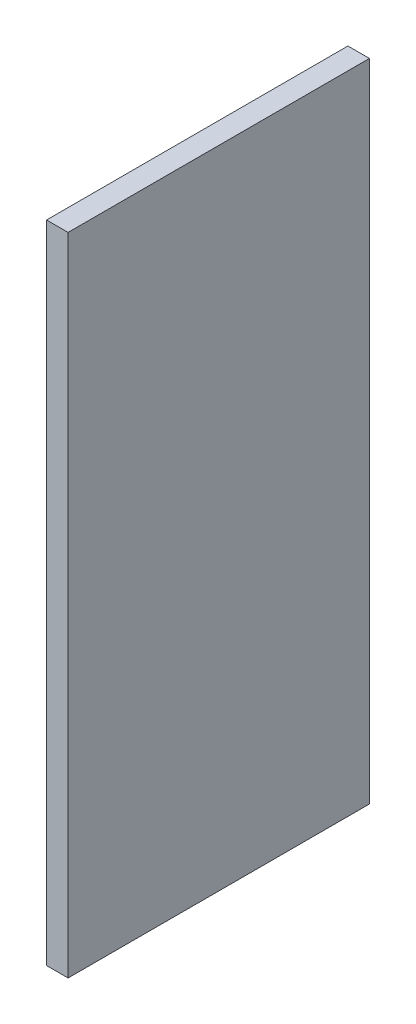
ISO-10303-21;
HEADER;
FILE_DESCRIPTION(('STEP AP214'),'2;1');
FILE_NAME('part.step','',(''),(''),'','','');
FILE_SCHEMA(('AUTOMOTIVE_DESIGN { 1 0 10303 214 1 1 1 1 }'));
ENDSEC;
DATA;
#1=APPLICATION_CONTEXT('core data for automotive mechanical design processes');
#2=APPLICATION_PROTOCOL_DEFINITION('international standard','automotive_design',2000,#1);
#3=PRODUCT_CONTEXT('',#1,'mechanical');
#4=PRODUCT('Part','Part','',(#3));
#5=PRODUCT_RELATED_PRODUCT_CATEGORY('part','',(#4));
#6=PRODUCT_DEFINITION_FORMATION('','',#4);
#7=PRODUCT_DEFINITION_CONTEXT('part definition',#1,'design');
#8=PRODUCT_DEFINITION('design','',#6,#7);
#9=PRODUCT_DEFINITION_SHAPE('','',#8);
#10=(LENGTH_UNIT() NAMED_UNIT(*) SI_UNIT(.MILLI.,.METRE.));
#11=(NAMED_UNIT(*) PLANE_ANGLE_UNIT() SI_UNIT($,.RADIAN.));
#12=(NAMED_UNIT(*) SI_UNIT($,.STERADIAN.) SOLID_ANGLE_UNIT());
#13=UNCERTAINTY_MEASURE_WITH_UNIT(LENGTH_MEASURE(1.E-05),#10,'distance_accuracy_value','');
#14=(GEOMETRIC_REPRESENTATION_CONTEXT(3) GLOBAL_UNCERTAINTY_ASSIGNED_CONTEXT((#13)) GLOBAL_UNIT_ASSIGNED_CONTEXT((#10,
#11,#12)) REPRESENTATION_CONTEXT('',''));
#15=CARTESIAN_POINT('',(0.,0.,0.));
#16=DIRECTION('',(0.,0.,1.));
#17=DIRECTION('',(1.,0.,0.));
#18=AXIS2_PLACEMENT_3D('',#15,#16,#17);
#19=CARTESIAN_POINT('',(5.,75.,-35.));
#20=DIRECTION('',(0.,0.,1.));
#21=DIRECTION('',(0.,-1.,0.));
#22=AXIS2_PLACEMENT_3D('',#19,#20,#21);
#23=PLANE('',#22);
#24=DIRECTION('',(0.,1.,0.));
#25=VECTOR('',#24,1.);
#26=CARTESIAN_POINT('',(0.,75.,-35.));
#27=LINE('',#26,#25);
#28=CARTESIAN_POINT('',(0.,-75.,-35.));
#29=VERTEX_POINT('',#28);
#30=CARTESIAN_POINT('',(0.,75.,-35.));
#31=VERTEX_POINT('',#30);
#32=EDGE_CURVE('E95',#29,#31,#27,.T.);
#33=ORIENTED_EDGE('',*,*,#32,.T.);
#34=DIRECTION('',(-1.,0.,0.));
#35=VECTOR('',#34,1.);
#36=CARTESIAN_POINT('',(5.,75.,-35.));
#37=LINE('',#36,#35);
#38=CARTESIAN_POINT('',(5.,75.,-35.));
#39=VERTEX_POINT('',#38);
#40=EDGE_CURVE('E11',#39,#31,#37,.T.);
#41=ORIENTED_EDGE('',*,*,#40,.F.);
#42=DIRECTION('',(0.,1.,0.));
#43=VECTOR('',#42,1.);
#44=CARTESIAN_POINT('',(5.,75.,-35.));
#45=LINE('',#44,#43);
#46=CARTESIAN_POINT('',(5.,-75.,-35.));
#47=VERTEX_POINT('',#46);
#48=EDGE_CURVE('E83',#47,#39,#45,.T.);
#49=ORIENTED_EDGE('',*,*,#48,.F.);
#50=DIRECTION('',(-1.,0.,0.));
#51=VECTOR('',#50,1.);
#52=CARTESIAN_POINT('',(5.,-75.,-35.));
#53=LINE('',#52,#51);
#54=EDGE_CURVE('E91',#47,#29,#53,.T.);
#55=ORIENTED_EDGE('',*,*,#54,.T.);
#56=EDGE_LOOP('',(#33,#41,#49,#55));
#57=FACE_BOUND('',#56,.T.);
#58=ADVANCED_FACE('F32',(#57),#23,.F.);
#59=CARTESIAN_POINT('',(5.,75.,35.));
#60=DIRECTION('',(0.,-1.,0.));
#61=DIRECTION('',(0.,0.,-1.));
#62=AXIS2_PLACEMENT_3D('',#59,#60,#61);
#63=PLANE('',#62);
#64=DIRECTION('',(0.,0.,1.));
#65=VECTOR('',#64,1.);
#66=CARTESIAN_POINT('',(0.,75.,35.));
#67=LINE('',#66,#65);
#68=CARTESIAN_POINT('',(0.,75.,35.));
#69=VERTEX_POINT('',#68);
#70=EDGE_CURVE('E87',#31,#69,#67,.T.);
#71=ORIENTED_EDGE('',*,*,#70,.T.);
#72=DIRECTION('',(-1.,0.,0.));
#73=VECTOR('',#72,1.);
#74=CARTESIAN_POINT('',(5.,75.,35.));
#75=LINE('',#74,#73);
#76=CARTESIAN_POINT('',(5.,75.,35.));
#77=VERTEX_POINT('',#76);
#78=EDGE_CURVE('E40',#77,#69,#75,.T.);
#79=ORIENTED_EDGE('',*,*,#78,.F.);
#80=DIRECTION('',(0.,0.,1.));
#81=VECTOR('',#80,1.);
#82=CARTESIAN_POINT('',(5.,75.,35.));
#83=LINE('',#82,#81);
#84=EDGE_CURVE('E78',#39,#77,#83,.T.);
#85=ORIENTED_EDGE('',*,*,#84,.F.);
#86=ORIENTED_EDGE('',*,*,#40,.T.);
#87=EDGE_LOOP('',(#71,#79,#85,#86));
#88=FACE_BOUND('',#87,.T.);
#89=ADVANCED_FACE('F86',(#88),#63,.F.);
#90=CARTESIAN_POINT('',(5.,75.,35.));
#91=DIRECTION('',(0.,0.,-1.));
#92=DIRECTION('',(0.,1.,0.));
#93=AXIS2_PLACEMENT_3D('',#90,#91,#92);
#94=PLANE('',#93);
#95=DIRECTION('',(0.,-1.,0.));
#96=VECTOR('',#95,1.);
#97=CARTESIAN_POINT('',(0.,75.,35.));
#98=LINE('',#97,#96);
#99=CARTESIAN_POINT('',(0.,-75.,35.));
#100=VERTEX_POINT('',#99);
#101=EDGE_CURVE('E65',#69,#100,#98,.T.);
#102=ORIENTED_EDGE('',*,*,#101,.T.);
#103=DIRECTION('',(-1.,0.,0.));
#104=VECTOR('',#103,1.);
#105=CARTESIAN_POINT('',(5.,-75.,35.));
#106=LINE('',#105,#104);
#107=CARTESIAN_POINT('',(5.,-75.,35.));
#108=VERTEX_POINT('',#107);
#109=EDGE_CURVE('E88',#108,#100,#106,.T.);
#110=ORIENTED_EDGE('',*,*,#109,.F.);
#111=DIRECTION('',(0.,-1.,0.));
#112=VECTOR('',#111,1.);
#113=CARTESIAN_POINT('',(5.,75.,35.));
#114=LINE('',#113,#112);
#115=EDGE_CURVE('E81',#77,#108,#114,.T.);
#116=ORIENTED_EDGE('',*,*,#115,.F.);
#117=ORIENTED_EDGE('',*,*,#78,.T.);
#118=EDGE_LOOP('',(#102,#110,#116,#117));
#119=FACE_BOUND('',#118,.T.);
#120=ADVANCED_FACE('F89',(#119),#94,.F.);
#121=CARTESIAN_POINT('',(5.,-75.,35.));
#122=DIRECTION('',(0.,1.,0.));
#123=DIRECTION('',(0.,0.,1.));
#124=AXIS2_PLACEMENT_3D('',#121,#122,#123);
#125=PLANE('',#124);
#126=DIRECTION('',(0.,0.,-1.));
#127=VECTOR('',#126,1.);
#128=CARTESIAN_POINT('',(0.,-75.,35.));
#129=LINE('',#128,#127);
#130=EDGE_CURVE('E71',#100,#29,#129,.T.);
#131=ORIENTED_EDGE('',*,*,#130,.T.);
#132=ORIENTED_EDGE('',*,*,#54,.F.);
#133=DIRECTION('',(0.,0.,-1.));
#134=VECTOR('',#133,1.);
#135=CARTESIAN_POINT('',(5.,-75.,35.));
#136=LINE('',#135,#134);
#137=EDGE_CURVE('E48',#108,#47,#136,.T.);
#138=ORIENTED_EDGE('',*,*,#137,.F.);
#139=ORIENTED_EDGE('',*,*,#109,.T.);
#140=EDGE_LOOP('',(#131,#132,#138,#139));
#141=FACE_BOUND('',#140,.T.);
#142=ADVANCED_FACE('F102',(#141),#125,.F.);
#143=CARTESIAN_POINT('',(5.,0.,0.));
#144=DIRECTION('',(1.,0.,0.));
#145=DIRECTION('',(0.,0.,-1.));
#146=AXIS2_PLACEMENT_3D('',#143,#144,#145);
#147=PLANE('',#146);
#148=ORIENTED_EDGE('',*,*,#48,.T.);
#149=ORIENTED_EDGE('',*,*,#84,.T.);
#150=ORIENTED_EDGE('',*,*,#115,.T.);
#151=ORIENTED_EDGE('',*,*,#137,.T.);
#152=EDGE_LOOP('',(#148,#149,#150,#151));
#153=FACE_BOUND('',#152,.T.);
#154=ADVANCED_FACE('F79',(#153),#147,.T.);
#155=CARTESIAN_POINT('',(0.,0.,0.));
#156=DIRECTION('',(1.,0.,0.));
#157=DIRECTION('',(0.,0.,-1.));
#158=AXIS2_PLACEMENT_3D('',#155,#156,#157);
#159=PLANE('',#158);
#160=ORIENTED_EDGE('',*,*,#32,.F.);
#161=ORIENTED_EDGE('',*,*,#130,.F.);
#162=ORIENTED_EDGE('',*,*,#101,.F.);
#163=ORIENTED_EDGE('',*,*,#70,.F.);
#164=EDGE_LOOP('',(#160,#161,#162,#163));
#165=FACE_BOUND('',#164,.T.);
#166=ADVANCED_FACE('F105',(#165),#159,.F.);
#167=CLOSED_SHELL('',(#58,#89,#120,#142,#154,#166));
#168=MANIFOLD_SOLID_BREP('B2',#167);
#169=ADVANCED_BREP_SHAPE_REPRESENTATION('',(#18,#168),#14);
#170=SHAPE_DEFINITION_REPRESENTATION(#9,#169);
ENDSEC;
END-ISO-10303-21;
